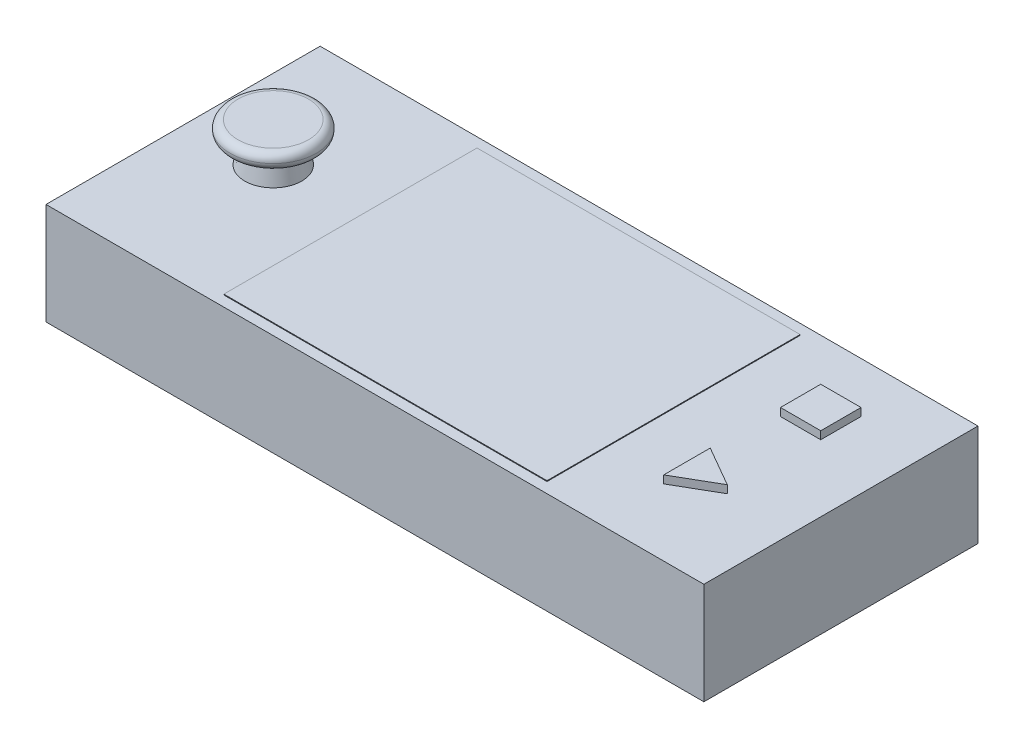
ISO-10303-21;
HEADER;
FILE_DESCRIPTION(('STEP AP214'),'2;1');
FILE_NAME('part.step','',(''),(''),'','','');
FILE_SCHEMA(('AUTOMOTIVE_DESIGN { 1 0 10303 214 1 1 1 1 }'));
ENDSEC;
DATA;
#1=APPLICATION_CONTEXT('core data for automotive mechanical design processes');
#2=APPLICATION_PROTOCOL_DEFINITION('international standard','automotive_design',2000,#1);
#3=PRODUCT_CONTEXT('',#1,'mechanical');
#4=PRODUCT('Part','Part','',(#3));
#5=PRODUCT_RELATED_PRODUCT_CATEGORY('part','',(#4));
#6=PRODUCT_DEFINITION_FORMATION('','',#4);
#7=PRODUCT_DEFINITION_CONTEXT('part definition',#1,'design');
#8=PRODUCT_DEFINITION('design','',#6,#7);
#9=PRODUCT_DEFINITION_SHAPE('','',#8);
#10=(LENGTH_UNIT() NAMED_UNIT(*) SI_UNIT(.MILLI.,.METRE.));
#11=(NAMED_UNIT(*) PLANE_ANGLE_UNIT() SI_UNIT($,.RADIAN.));
#12=(NAMED_UNIT(*) SI_UNIT($,.STERADIAN.) SOLID_ANGLE_UNIT());
#13=UNCERTAINTY_MEASURE_WITH_UNIT(LENGTH_MEASURE(1.E-05),#10,'distance_accuracy_value','');
#14=(GEOMETRIC_REPRESENTATION_CONTEXT(3) GLOBAL_UNCERTAINTY_ASSIGNED_CONTEXT((#13)) GLOBAL_UNIT_ASSIGNED_CONTEXT((#10,
#11,#12)) REPRESENTATION_CONTEXT('',''));
#15=CARTESIAN_POINT('',(0.,0.,0.));
#16=DIRECTION('',(0.,0.,1.));
#17=DIRECTION('',(1.,0.,0.));
#18=AXIS2_PLACEMENT_3D('',#15,#16,#17);
#19=CARTESIAN_POINT('',(0.,13.,0.));
#20=DIRECTION('',(0.,-1.,0.));
#21=DIRECTION('',(0.,0.,-1.));
#22=AXIS2_PLACEMENT_3D('',#19,#20,#21);
#23=PLANE('',#22);
#24=DIRECTION('',(0.,0.,1.));
#25=VECTOR('',#24,1.);
#26=CARTESIAN_POINT('',(28.3414793189935,13.,0.));
#27=LINE('',#26,#25);
#28=CARTESIAN_POINT('',(28.3414793189935,13.,3.03018633537985));
#29=VERTEX_POINT('',#28);
#30=CARTESIAN_POINT('',(28.3414793189935,13.,8.96750253399958));
#31=VERTEX_POINT('',#30);
#32=EDGE_CURVE('E295',#29,#31,#27,.T.);
#33=ORIENTED_EDGE('',*,*,#32,.F.);
#34=DIRECTION('',(-0.866025403784439,0.,-0.5));
#35=VECTOR('',#34,1.);
#36=CARTESIAN_POINT('',(5.77326065742866,13.,-9.99958078400494));
#37=LINE('',#36,#35);
#38=CARTESIAN_POINT('',(33.4833459772991,13.,5.99884443468971));
#39=VERTEX_POINT('',#38);
#40=EDGE_CURVE('E301',#39,#29,#37,.T.);
#41=ORIENTED_EDGE('',*,*,#40,.F.);
#42=DIRECTION('',(0.866025403784439,0.,-0.5));
#43=VECTOR('',#42,1.);
#44=CARTESIAN_POINT('',(10.9684123312209,13.,18.9978474360395));
#45=LINE('',#44,#43);
#46=EDGE_CURVE('E311',#31,#39,#45,.T.);
#47=ORIENTED_EDGE('',*,*,#46,.F.);
#48=EDGE_LOOP('',(#33,#41,#47));
#49=FACE_BOUND('',#48,.T.);
#50=DIRECTION('',(1.,0.,0.));
#51=VECTOR('',#50,1.);
#52=CARTESIAN_POINT('',(0.,13.,-11.0794983946822));
#53=LINE('',#52,#51);
#54=CARTESIAN_POINT('',(28.3414793189935,13.,-11.0794983946822));
#55=VERTEX_POINT('',#54);
#56=CARTESIAN_POINT('',(33.4833459772991,13.,-11.0794983946822));
#57=VERTEX_POINT('',#56);
#58=EDGE_CURVE('E348',#55,#57,#53,.T.);
#59=ORIENTED_EDGE('',*,*,#58,.T.);
#60=DIRECTION('',(0.,0.,1.));
#61=VECTOR('',#60,1.);
#62=CARTESIAN_POINT('',(33.4833459772991,13.,0.));
#63=LINE('',#62,#61);
#64=CARTESIAN_POINT('',(33.4833459772991,13.,-5.93763173637665));
#65=VERTEX_POINT('',#64);
#66=EDGE_CURVE('E329',#57,#65,#63,.T.);
#67=ORIENTED_EDGE('',*,*,#66,.T.);
#68=DIRECTION('',(1.,0.,0.));
#69=VECTOR('',#68,1.);
#70=CARTESIAN_POINT('',(0.,13.,-5.93763173637665));
#71=LINE('',#70,#69);
#72=CARTESIAN_POINT('',(28.3414793189935,13.,-5.93763173637665));
#73=VERTEX_POINT('',#72);
#74=EDGE_CURVE('E335',#73,#65,#71,.T.);
#75=ORIENTED_EDGE('',*,*,#74,.F.);
#76=DIRECTION('',(0.,0.,1.));
#77=VECTOR('',#76,1.);
#78=CARTESIAN_POINT('',(28.3414793189935,13.,0.));
#79=LINE('',#78,#77);
#80=EDGE_CURVE('E351',#55,#73,#79,.T.);
#81=ORIENTED_EDGE('',*,*,#80,.F.);
#82=EDGE_LOOP('',(#59,#67,#75,#81));
#83=FACE_BOUND('',#82,.T.);
#84=CARTESIAN_POINT('',(-31.8918158211568,13.,-1.40789206120276));
#85=DIRECTION('',(0.,-1.,0.));
#86=DIRECTION('',(0.,0.,-1.));
#87=AXIS2_PLACEMENT_3D('',#84,#85,#86);
#88=CIRCLE('',#87,3.63687920541314);
#89=CARTESIAN_POINT('',(-31.8918158211568,13.,-5.0447712666159));
#90=VERTEX_POINT('',#89);
#91=EDGE_CURVE('E419',#90,#90,#88,.F.);
#92=ORIENTED_EDGE('',*,*,#91,.F.);
#93=EDGE_LOOP('',(#92));
#94=FACE_BOUND('',#93,.T.);
#95=DIRECTION('',(0.,0.,-1.));
#96=VECTOR('',#95,1.);
#97=CARTESIAN_POINT('',(42.,13.,17.5));
#98=LINE('',#97,#96);
#99=CARTESIAN_POINT('',(42.,13.,17.5));
#100=VERTEX_POINT('',#99);
#101=CARTESIAN_POINT('',(42.,13.,-17.5));
#102=VERTEX_POINT('',#101);
#103=EDGE_CURVE('E378',#100,#102,#98,.T.);
#104=ORIENTED_EDGE('',*,*,#103,.T.);
#105=DIRECTION('',(-1.,0.,0.));
#106=VECTOR('',#105,1.);
#107=CARTESIAN_POINT('',(-42.,13.,-17.5));
#108=LINE('',#107,#106);
#109=CARTESIAN_POINT('',(-42.,13.,-17.5));
#110=VERTEX_POINT('',#109);
#111=EDGE_CURVE('E382',#102,#110,#108,.T.);
#112=ORIENTED_EDGE('',*,*,#111,.T.);
#113=DIRECTION('',(0.,0.,1.));
#114=VECTOR('',#113,1.);
#115=CARTESIAN_POINT('',(-42.,13.,17.5));
#116=LINE('',#115,#114);
#117=CARTESIAN_POINT('',(-42.,13.,17.5));
#118=VERTEX_POINT('',#117);
#119=EDGE_CURVE('E386',#110,#118,#116,.T.);
#120=ORIENTED_EDGE('',*,*,#119,.T.);
#121=DIRECTION('',(1.,0.,0.));
#122=VECTOR('',#121,1.);
#123=CARTESIAN_POINT('',(-42.,13.,17.5));
#124=LINE('',#123,#122);
#125=EDGE_CURVE('E389',#118,#100,#124,.T.);
#126=ORIENTED_EDGE('',*,*,#125,.T.);
#127=EDGE_LOOP('',(#104,#112,#120,#126));
#128=FACE_BOUND('',#127,.T.);
#129=DIRECTION('',(1.,0.,0.));
#130=VECTOR('',#129,1.);
#131=CARTESIAN_POINT('',(0.,13.,16.1601523546745));
#132=LINE('',#131,#130);
#133=CARTESIAN_POINT('',(-20.6286793315352,13.,16.1601523546745));
#134=VERTEX_POINT('',#133);
#135=CARTESIAN_POINT('',(20.6286793315352,13.,16.1601523546745));
#136=VERTEX_POINT('',#135);
#137=EDGE_CURVE('E271',#134,#136,#132,.T.);
#138=ORIENTED_EDGE('',*,*,#137,.F.);
#139=DIRECTION('',(0.,0.,-1.));
#140=VECTOR('',#139,1.);
#141=CARTESIAN_POINT('',(-20.6286793315352,13.,0.));
#142=LINE('',#141,#140);
#143=CARTESIAN_POINT('',(-20.6286793315352,13.,-16.1601523546745));
#144=VERTEX_POINT('',#143);
#145=EDGE_CURVE('E259',#134,#144,#142,.T.);
#146=ORIENTED_EDGE('',*,*,#145,.T.);
#147=DIRECTION('',(1.,0.,0.));
#148=VECTOR('',#147,1.);
#149=CARTESIAN_POINT('',(0.,13.,-16.1601523546745));
#150=LINE('',#149,#148);
#151=CARTESIAN_POINT('',(20.6286793315352,13.,-16.1601523546745));
#152=VERTEX_POINT('',#151);
#153=EDGE_CURVE('E68',#144,#152,#150,.T.);
#154=ORIENTED_EDGE('',*,*,#153,.T.);
#155=DIRECTION('',(0.,0.,-1.));
#156=VECTOR('',#155,1.);
#157=CARTESIAN_POINT('',(20.6286793315352,13.,0.));
#158=LINE('',#157,#156);
#159=EDGE_CURVE('E275',#136,#152,#158,.T.);
#160=ORIENTED_EDGE('',*,*,#159,.F.);
#161=EDGE_LOOP('',(#138,#146,#154,#160));
#162=FACE_BOUND('',#161,.T.);
#163=ADVANCED_FACE('F43',(#49,#83,#94,#128,#162),#23,.F.);
#164=CARTESIAN_POINT('',(42.,13.,17.5));
#165=DIRECTION('',(-1.,0.,0.));
#166=DIRECTION('',(0.,0.,1.));
#167=AXIS2_PLACEMENT_3D('',#164,#165,#166);
#168=PLANE('',#167);
#169=DIRECTION('',(0.,0.,-1.));
#170=VECTOR('',#169,1.);
#171=CARTESIAN_POINT('',(42.,0.,17.5));
#172=LINE('',#171,#170);
#173=CARTESIAN_POINT('',(42.,0.,17.5));
#174=VERTEX_POINT('',#173);
#175=CARTESIAN_POINT('',(42.,0.,-17.5));
#176=VERTEX_POINT('',#175);
#177=EDGE_CURVE('E377',#174,#176,#172,.T.);
#178=ORIENTED_EDGE('',*,*,#177,.T.);
#179=DIRECTION('',(0.,-1.,0.));
#180=VECTOR('',#179,1.);
#181=CARTESIAN_POINT('',(42.,13.,-17.5));
#182=LINE('',#181,#180);
#183=EDGE_CURVE('E415',#102,#176,#182,.T.);
#184=ORIENTED_EDGE('',*,*,#183,.F.);
#185=ORIENTED_EDGE('',*,*,#103,.F.);
#186=DIRECTION('',(0.,-1.,0.));
#187=VECTOR('',#186,1.);
#188=CARTESIAN_POINT('',(42.,13.,17.5));
#189=LINE('',#188,#187);
#190=EDGE_CURVE('E392',#100,#174,#189,.T.);
#191=ORIENTED_EDGE('',*,*,#190,.T.);
#192=EDGE_LOOP('',(#178,#184,#185,#191));
#193=FACE_BOUND('',#192,.T.);
#194=ADVANCED_FACE('F462',(#193),#168,.F.);
#195=CARTESIAN_POINT('',(-42.,13.,-17.5));
#196=DIRECTION('',(0.,0.,1.));
#197=DIRECTION('',(1.,0.,0.));
#198=AXIS2_PLACEMENT_3D('',#195,#196,#197);
#199=PLANE('',#198);
#200=DIRECTION('',(-1.,0.,0.));
#201=VECTOR('',#200,1.);
#202=CARTESIAN_POINT('',(-42.,0.,-17.5));
#203=LINE('',#202,#201);
#204=CARTESIAN_POINT('',(-42.,0.,-17.5));
#205=VERTEX_POINT('',#204);
#206=EDGE_CURVE('E396',#176,#205,#203,.T.);
#207=ORIENTED_EDGE('',*,*,#206,.T.);
#208=DIRECTION('',(0.,-1.,0.));
#209=VECTOR('',#208,1.);
#210=CARTESIAN_POINT('',(-42.,13.,-17.5));
#211=LINE('',#210,#209);
#212=EDGE_CURVE('E411',#110,#205,#211,.T.);
#213=ORIENTED_EDGE('',*,*,#212,.F.);
#214=ORIENTED_EDGE('',*,*,#111,.F.);
#215=ORIENTED_EDGE('',*,*,#183,.T.);
#216=EDGE_LOOP('',(#207,#213,#214,#215));
#217=FACE_BOUND('',#216,.T.);
#218=ADVANCED_FACE('F473',(#217),#199,.F.);
#219=CARTESIAN_POINT('',(-42.,13.,17.5));
#220=DIRECTION('',(1.,0.,0.));
#221=DIRECTION('',(0.,0.,-1.));
#222=AXIS2_PLACEMENT_3D('',#219,#220,#221);
#223=PLANE('',#222);
#224=DIRECTION('',(0.,0.,1.));
#225=VECTOR('',#224,1.);
#226=CARTESIAN_POINT('',(-42.,0.,17.5));
#227=LINE('',#226,#225);
#228=CARTESIAN_POINT('',(-42.,0.,17.5));
#229=VERTEX_POINT('',#228);
#230=EDGE_CURVE('E399',#205,#229,#227,.T.);
#231=ORIENTED_EDGE('',*,*,#230,.T.);
#232=DIRECTION('',(0.,-1.,0.));
#233=VECTOR('',#232,1.);
#234=CARTESIAN_POINT('',(-42.,13.,17.5));
#235=LINE('',#234,#233);
#236=EDGE_CURVE('E407',#118,#229,#235,.T.);
#237=ORIENTED_EDGE('',*,*,#236,.F.);
#238=ORIENTED_EDGE('',*,*,#119,.F.);
#239=ORIENTED_EDGE('',*,*,#212,.T.);
#240=EDGE_LOOP('',(#231,#237,#238,#239));
#241=FACE_BOUND('',#240,.T.);
#242=ADVANCED_FACE('F470',(#241),#223,.F.);
#243=CARTESIAN_POINT('',(-42.,13.,17.5));
#244=DIRECTION('',(0.,0.,-1.));
#245=DIRECTION('',(-1.,0.,0.));
#246=AXIS2_PLACEMENT_3D('',#243,#244,#245);
#247=PLANE('',#246);
#248=DIRECTION('',(1.,0.,0.));
#249=VECTOR('',#248,1.);
#250=CARTESIAN_POINT('',(-42.,0.,17.5));
#251=LINE('',#250,#249);
#252=EDGE_CURVE('E383',#229,#174,#251,.T.);
#253=ORIENTED_EDGE('',*,*,#252,.T.);
#254=ORIENTED_EDGE('',*,*,#190,.F.);
#255=ORIENTED_EDGE('',*,*,#125,.F.);
#256=ORIENTED_EDGE('',*,*,#236,.T.);
#257=EDGE_LOOP('',(#253,#254,#255,#256));
#258=FACE_BOUND('',#257,.T.);
#259=ADVANCED_FACE('F450',(#258),#247,.F.);
#260=CARTESIAN_POINT('',(0.,0.,0.));
#261=DIRECTION('',(0.,-1.,0.));
#262=DIRECTION('',(0.,0.,-1.));
#263=AXIS2_PLACEMENT_3D('',#260,#261,#262);
#264=PLANE('',#263);
#265=CARTESIAN_POINT('',(-38.,0.,-8.));
#266=DIRECTION('',(0.,-1.,0.));
#267=DIRECTION('',(0.,0.,-1.));
#268=AXIS2_PLACEMENT_3D('',#265,#266,#267);
#269=CIRCLE('',#268,2.);
#270=CARTESIAN_POINT('',(-38.,0.,-10.));
#271=VERTEX_POINT('',#270);
#272=EDGE_CURVE('E234',#271,#271,#269,.T.);
#273=ORIENTED_EDGE('',*,*,#272,.F.);
#274=EDGE_LOOP('',(#273));
#275=FACE_BOUND('',#274,.T.);
#276=CARTESIAN_POINT('',(9.99999999999999,0.,8.));
#277=DIRECTION('',(0.,-1.,0.));
#278=DIRECTION('',(0.,0.,-1.));
#279=AXIS2_PLACEMENT_3D('',#276,#277,#278);
#280=CIRCLE('',#279,2.);
#281=CARTESIAN_POINT('',(9.99999999999999,0.,6.));
#282=VERTEX_POINT('',#281);
#283=EDGE_CURVE('E242',#282,#282,#280,.T.);
#284=ORIENTED_EDGE('',*,*,#283,.F.);
#285=EDGE_LOOP('',(#284));
#286=FACE_BOUND('',#285,.T.);
#287=CARTESIAN_POINT('',(9.99999999999999,0.,-8.));
#288=DIRECTION('',(0.,-1.,0.));
#289=DIRECTION('',(0.,0.,-1.));
#290=AXIS2_PLACEMENT_3D('',#287,#288,#289);
#291=CIRCLE('',#290,2.);
#292=CARTESIAN_POINT('',(9.99999999999999,0.,-10.));
#293=VERTEX_POINT('',#292);
#294=EDGE_CURVE('E206',#293,#293,#291,.T.);
#295=ORIENTED_EDGE('',*,*,#294,.F.);
#296=EDGE_LOOP('',(#295));
#297=FACE_BOUND('',#296,.T.);
#298=DIRECTION('',(0.,0.,1.));
#299=VECTOR('',#298,1.);
#300=CARTESIAN_POINT('',(25.5,0.,10.));
#301=LINE('',#300,#299);
#302=CARTESIAN_POINT('',(25.5,0.,-10.));
#303=VERTEX_POINT('',#302);
#304=CARTESIAN_POINT('',(25.5,0.,10.));
#305=VERTEX_POINT('',#304);
#306=EDGE_CURVE('E60',#303,#305,#301,.T.);
#307=ORIENTED_EDGE('',*,*,#306,.F.);
#308=DIRECTION('',(1.,0.,0.));
#309=VECTOR('',#308,1.);
#310=CARTESIAN_POINT('',(16.5,0.,-10.));
#311=LINE('',#310,#309);
#312=CARTESIAN_POINT('',(16.5,0.,-10.));
#313=VERTEX_POINT('',#312);
#314=EDGE_CURVE('E199',#313,#303,#311,.T.);
#315=ORIENTED_EDGE('',*,*,#314,.F.);
#316=DIRECTION('',(0.,0.,-1.));
#317=VECTOR('',#316,1.);
#318=CARTESIAN_POINT('',(16.5,0.,10.));
#319=LINE('',#318,#317);
#320=CARTESIAN_POINT('',(16.5,0.,10.));
#321=VERTEX_POINT('',#320);
#322=EDGE_CURVE('E203',#321,#313,#319,.T.);
#323=ORIENTED_EDGE('',*,*,#322,.F.);
#324=DIRECTION('',(-1.,0.,0.));
#325=VECTOR('',#324,1.);
#326=CARTESIAN_POINT('',(16.5,0.,10.));
#327=LINE('',#326,#325);
#328=EDGE_CURVE('E215',#305,#321,#327,.T.);
#329=ORIENTED_EDGE('',*,*,#328,.F.);
#330=EDGE_LOOP('',(#307,#315,#323,#329));
#331=FACE_BOUND('',#330,.T.);
#332=CARTESIAN_POINT('',(-38.,0.,8.));
#333=DIRECTION('',(0.,-1.,0.));
#334=DIRECTION('',(0.,0.,-1.));
#335=AXIS2_PLACEMENT_3D('',#332,#333,#334);
#336=CIRCLE('',#335,2.);
#337=CARTESIAN_POINT('',(-38.,0.,6.));
#338=VERTEX_POINT('',#337);
#339=EDGE_CURVE('E233',#338,#338,#336,.T.);
#340=ORIENTED_EDGE('',*,*,#339,.F.);
#341=EDGE_LOOP('',(#340));
#342=FACE_BOUND('',#341,.T.);
#343=ORIENTED_EDGE('',*,*,#177,.F.);
#344=ORIENTED_EDGE('',*,*,#252,.F.);
#345=ORIENTED_EDGE('',*,*,#230,.F.);
#346=ORIENTED_EDGE('',*,*,#206,.F.);
#347=EDGE_LOOP('',(#343,#344,#345,#346));
#348=FACE_BOUND('',#347,.T.);
#349=ADVANCED_FACE('F446',(#275,#286,#297,#331,#342,#348),#264,.T.);
#350=CARTESIAN_POINT('',(-31.8918158211568,13.,-1.40789206120276));
#351=DIRECTION('',(0.,-1.,0.));
#352=DIRECTION('',(0.,0.,1.));
#353=AXIS2_PLACEMENT_3D('',#350,#351,#352);
#354=CONICAL_SURFACE('',#353,3.63687920541314,0.174532925199433);
#355=CARTESIAN_POINT('',(-31.8918158211568,16.,-1.40789206120276));
#356=DIRECTION('',(0.,1.,0.));
#357=DIRECTION('',(0.,0.,1.));
#358=AXIS2_PLACEMENT_3D('',#355,#356,#357);
#359=CIRCLE('',#358,3.10789826328775);
#360=CARTESIAN_POINT('',(-31.8918158211568,16.,1.70000620208499));
#361=VERTEX_POINT('',#360);
#362=EDGE_CURVE('E373',#361,#361,#359,.T.);
#363=ORIENTED_EDGE('',*,*,#362,.F.);
#364=EDGE_LOOP('',(#363));
#365=FACE_BOUND('',#364,.T.);
#366=ORIENTED_EDGE('',*,*,#91,.T.);
#367=EDGE_LOOP('',(#366));
#368=FACE_BOUND('',#367,.T.);
#369=ADVANCED_FACE('F449',(#365,#368),#354,.T.);
#370=CARTESIAN_POINT('',(33.4833459772991,14.,0.));
#371=DIRECTION('',(1.,0.,0.));
#372=DIRECTION('',(0.,0.,-1.));
#373=AXIS2_PLACEMENT_3D('',#370,#371,#372);
#374=PLANE('',#373);
#375=ORIENTED_EDGE('',*,*,#66,.F.);
#376=DIRECTION('',(0.,-1.,0.));
#377=VECTOR('',#376,1.);
#378=CARTESIAN_POINT('',(33.4833459772991,14.,-11.0794983946822));
#379=LINE('',#378,#377);
#380=CARTESIAN_POINT('',(33.4833459772991,14.,-11.0794983946822));
#381=VERTEX_POINT('',#380);
#382=EDGE_CURVE('E369',#381,#57,#379,.T.);
#383=ORIENTED_EDGE('',*,*,#382,.F.);
#384=DIRECTION('',(0.,0.,1.));
#385=VECTOR('',#384,1.);
#386=CARTESIAN_POINT('',(33.4833459772991,14.,0.));
#387=LINE('',#386,#385);
#388=CARTESIAN_POINT('',(33.4833459772991,14.,-5.93763173637665));
#389=VERTEX_POINT('',#388);
#390=EDGE_CURVE('E330',#381,#389,#387,.T.);
#391=ORIENTED_EDGE('',*,*,#390,.T.);
#392=DIRECTION('',(0.,-1.,0.));
#393=VECTOR('',#392,1.);
#394=CARTESIAN_POINT('',(33.4833459772991,14.,-5.93763173637665));
#395=LINE('',#394,#393);
#396=EDGE_CURVE('E345',#389,#65,#395,.T.);
#397=ORIENTED_EDGE('',*,*,#396,.T.);
#398=EDGE_LOOP('',(#375,#383,#391,#397));
#399=FACE_BOUND('',#398,.T.);
#400=ADVANCED_FACE('F537',(#399),#374,.T.);
#401=CARTESIAN_POINT('',(0.,14.,-11.0794983946822));
#402=DIRECTION('',(0.,0.,-1.));
#403=DIRECTION('',(-1.,0.,0.));
#404=AXIS2_PLACEMENT_3D('',#401,#402,#403);
#405=PLANE('',#404);
#406=ORIENTED_EDGE('',*,*,#58,.F.);
#407=DIRECTION('',(0.,-1.,0.));
#408=VECTOR('',#407,1.);
#409=CARTESIAN_POINT('',(28.3414793189935,14.,-11.0794983946822));
#410=LINE('',#409,#408);
#411=CARTESIAN_POINT('',(28.3414793189935,14.,-11.0794983946822));
#412=VERTEX_POINT('',#411);
#413=EDGE_CURVE('E365',#412,#55,#410,.T.);
#414=ORIENTED_EDGE('',*,*,#413,.F.);
#415=DIRECTION('',(1.,0.,0.));
#416=VECTOR('',#415,1.);
#417=CARTESIAN_POINT('',(0.,14.,-11.0794983946822));
#418=LINE('',#417,#416);
#419=EDGE_CURVE('E334',#412,#381,#418,.T.);
#420=ORIENTED_EDGE('',*,*,#419,.T.);
#421=ORIENTED_EDGE('',*,*,#382,.T.);
#422=EDGE_LOOP('',(#406,#414,#420,#421));
#423=FACE_BOUND('',#422,.T.);
#424=ADVANCED_FACE('F533',(#423),#405,.T.);
#425=CARTESIAN_POINT('',(28.3414793189935,14.,0.));
#426=DIRECTION('',(1.,0.,0.));
#427=DIRECTION('',(0.,0.,-1.));
#428=AXIS2_PLACEMENT_3D('',#425,#426,#427);
#429=PLANE('',#428);
#430=ORIENTED_EDGE('',*,*,#80,.T.);
#431=DIRECTION('',(0.,-1.,0.));
#432=VECTOR('',#431,1.);
#433=CARTESIAN_POINT('',(28.3414793189935,14.,-5.93763173637665));
#434=LINE('',#433,#432);
#435=CARTESIAN_POINT('',(28.3414793189935,14.,-5.93763173637665));
#436=VERTEX_POINT('',#435);
#437=EDGE_CURVE('E361',#436,#73,#434,.T.);
#438=ORIENTED_EDGE('',*,*,#437,.F.);
#439=DIRECTION('',(0.,0.,1.));
#440=VECTOR('',#439,1.);
#441=CARTESIAN_POINT('',(28.3414793189935,14.,0.));
#442=LINE('',#441,#440);
#443=EDGE_CURVE('E339',#412,#436,#442,.T.);
#444=ORIENTED_EDGE('',*,*,#443,.F.);
#445=ORIENTED_EDGE('',*,*,#413,.T.);
#446=EDGE_LOOP('',(#430,#438,#444,#445));
#447=FACE_BOUND('',#446,.T.);
#448=ADVANCED_FACE('F529',(#447),#429,.F.);
#449=CARTESIAN_POINT('',(0.,14.,-5.93763173637665));
#450=DIRECTION('',(0.,0.,-1.));
#451=DIRECTION('',(-1.,0.,0.));
#452=AXIS2_PLACEMENT_3D('',#449,#450,#451);
#453=PLANE('',#452);
#454=ORIENTED_EDGE('',*,*,#74,.T.);
#455=ORIENTED_EDGE('',*,*,#396,.F.);
#456=DIRECTION('',(1.,0.,0.));
#457=VECTOR('',#456,1.);
#458=CARTESIAN_POINT('',(0.,14.,-5.93763173637665));
#459=LINE('',#458,#457);
#460=EDGE_CURVE('E342',#436,#389,#459,.T.);
#461=ORIENTED_EDGE('',*,*,#460,.F.);
#462=ORIENTED_EDGE('',*,*,#437,.T.);
#463=EDGE_LOOP('',(#454,#455,#461,#462));
#464=FACE_BOUND('',#463,.T.);
#465=ADVANCED_FACE('F525',(#464),#453,.F.);
#466=CARTESIAN_POINT('',(0.,14.,0.));
#467=DIRECTION('',(0.,1.,0.));
#468=DIRECTION('',(0.,0.,1.));
#469=AXIS2_PLACEMENT_3D('',#466,#467,#468);
#470=PLANE('',#469);
#471=ORIENTED_EDGE('',*,*,#390,.F.);
#472=ORIENTED_EDGE('',*,*,#419,.F.);
#473=ORIENTED_EDGE('',*,*,#443,.T.);
#474=ORIENTED_EDGE('',*,*,#460,.T.);
#475=EDGE_LOOP('',(#471,#472,#473,#474));
#476=FACE_BOUND('',#475,.T.);
#477=ADVANCED_FACE('F521',(#476),#470,.T.);
#478=CARTESIAN_POINT('',(28.3414793189935,14.,0.));
#479=DIRECTION('',(1.,0.,0.));
#480=DIRECTION('',(0.,0.,-1.));
#481=AXIS2_PLACEMENT_3D('',#478,#479,#480);
#482=PLANE('',#481);
#483=ORIENTED_EDGE('',*,*,#32,.T.);
#484=DIRECTION('',(0.,-1.,0.));
#485=VECTOR('',#484,1.);
#486=CARTESIAN_POINT('',(28.3414793189935,14.,8.96750253399958));
#487=LINE('',#486,#485);
#488=CARTESIAN_POINT('',(28.3414793189935,14.,8.96750253399958));
#489=VERTEX_POINT('',#488);
#490=EDGE_CURVE('E325',#489,#31,#487,.T.);
#491=ORIENTED_EDGE('',*,*,#490,.F.);
#492=DIRECTION('',(0.,0.,1.));
#493=VECTOR('',#492,1.);
#494=CARTESIAN_POINT('',(28.3414793189935,14.,0.));
#495=LINE('',#494,#493);
#496=CARTESIAN_POINT('',(28.3414793189935,14.,3.03018633537985));
#497=VERTEX_POINT('',#496);
#498=EDGE_CURVE('E296',#497,#489,#495,.T.);
#499=ORIENTED_EDGE('',*,*,#498,.F.);
#500=DIRECTION('',(0.,-1.,0.));
#501=VECTOR('',#500,1.);
#502=CARTESIAN_POINT('',(28.3414793189935,14.,3.03018633537985));
#503=LINE('',#502,#501);
#504=EDGE_CURVE('E307',#497,#29,#503,.T.);
#505=ORIENTED_EDGE('',*,*,#504,.T.);
#506=EDGE_LOOP('',(#483,#491,#499,#505));
#507=FACE_BOUND('',#506,.T.);
#508=ADVANCED_FACE('F517',(#507),#482,.F.);
#509=CARTESIAN_POINT('',(10.9684123312209,14.,18.9978474360395));
#510=DIRECTION('',(-0.5,0.,-0.866025403784439));
#511=DIRECTION('',(-0.866025403784439,0.,0.5));
#512=AXIS2_PLACEMENT_3D('',#509,#510,#511);
#513=PLANE('',#512);
#514=ORIENTED_EDGE('',*,*,#46,.T.);
#515=DIRECTION('',(0.,-1.,0.));
#516=VECTOR('',#515,1.);
#517=CARTESIAN_POINT('',(33.4833459772991,14.,5.99884443468971));
#518=LINE('',#517,#516);
#519=CARTESIAN_POINT('',(33.4833459772991,14.,5.99884443468971));
#520=VERTEX_POINT('',#519);
#521=EDGE_CURVE('E321',#520,#39,#518,.T.);
#522=ORIENTED_EDGE('',*,*,#521,.F.);
#523=DIRECTION('',(0.866025403784439,0.,-0.5));
#524=VECTOR('',#523,1.);
#525=CARTESIAN_POINT('',(10.9684123312209,14.,18.9978474360395));
#526=LINE('',#525,#524);
#527=EDGE_CURVE('E300',#489,#520,#526,.T.);
#528=ORIENTED_EDGE('',*,*,#527,.F.);
#529=ORIENTED_EDGE('',*,*,#490,.T.);
#530=EDGE_LOOP('',(#514,#522,#528,#529));
#531=FACE_BOUND('',#530,.T.);
#532=ADVANCED_FACE('F513',(#531),#513,.F.);
#533=CARTESIAN_POINT('',(5.77326065742866,14.,-9.99958078400494));
#534=DIRECTION('',(-0.5,0.,0.866025403784439));
#535=DIRECTION('',(0.866025403784439,0.,0.5));
#536=AXIS2_PLACEMENT_3D('',#533,#534,#535);
#537=PLANE('',#536);
#538=ORIENTED_EDGE('',*,*,#40,.T.);
#539=ORIENTED_EDGE('',*,*,#504,.F.);
#540=DIRECTION('',(-0.866025403784439,0.,-0.5));
#541=VECTOR('',#540,1.);
#542=CARTESIAN_POINT('',(5.77326065742866,14.,-9.99958078400494));
#543=LINE('',#542,#541);
#544=EDGE_CURVE('E304',#520,#497,#543,.T.);
#545=ORIENTED_EDGE('',*,*,#544,.F.);
#546=ORIENTED_EDGE('',*,*,#521,.T.);
#547=EDGE_LOOP('',(#538,#539,#545,#546));
#548=FACE_BOUND('',#547,.T.);
#549=ADVANCED_FACE('F509',(#548),#537,.F.);
#550=CARTESIAN_POINT('',(0.,14.,0.));
#551=DIRECTION('',(0.,1.,0.));
#552=DIRECTION('',(0.,0.,1.));
#553=AXIS2_PLACEMENT_3D('',#550,#551,#552);
#554=PLANE('',#553);
#555=ORIENTED_EDGE('',*,*,#498,.T.);
#556=ORIENTED_EDGE('',*,*,#527,.T.);
#557=ORIENTED_EDGE('',*,*,#544,.T.);
#558=EDGE_LOOP('',(#555,#556,#557));
#559=FACE_BOUND('',#558,.T.);
#560=ADVANCED_FACE('F503',(#559),#554,.T.);
#561=CARTESIAN_POINT('',(0.,13.1,16.1601523546745));
#562=DIRECTION('',(0.,0.,-1.));
#563=DIRECTION('',(-1.,0.,0.));
#564=AXIS2_PLACEMENT_3D('',#561,#562,#563);
#565=PLANE('',#564);
#566=ORIENTED_EDGE('',*,*,#137,.T.);
#567=DIRECTION('',(0.,-1.,0.));
#568=VECTOR('',#567,1.);
#569=CARTESIAN_POINT('',(20.6286793315352,13.1,16.1601523546745));
#570=LINE('',#569,#568);
#571=CARTESIAN_POINT('',(20.6286793315352,13.1,16.1601523546745));
#572=VERTEX_POINT('',#571);
#573=EDGE_CURVE('E292',#572,#136,#570,.T.);
#574=ORIENTED_EDGE('',*,*,#573,.F.);
#575=DIRECTION('',(1.,0.,0.));
#576=VECTOR('',#575,1.);
#577=CARTESIAN_POINT('',(0.,13.1,16.1601523546745));
#578=LINE('',#577,#576);
#579=CARTESIAN_POINT('',(-20.6286793315352,13.1,16.1601523546745));
#580=VERTEX_POINT('',#579);
#581=EDGE_CURVE('E254',#580,#572,#578,.T.);
#582=ORIENTED_EDGE('',*,*,#581,.F.);
#583=DIRECTION('',(0.,-1.,0.));
#584=VECTOR('',#583,1.);
#585=CARTESIAN_POINT('',(-20.6286793315352,13.1,16.1601523546745));
#586=LINE('',#585,#584);
#587=EDGE_CURVE('E270',#580,#134,#586,.T.);
#588=ORIENTED_EDGE('',*,*,#587,.T.);
#589=EDGE_LOOP('',(#566,#574,#582,#588));
#590=FACE_BOUND('',#589,.T.);
#591=ADVANCED_FACE('F484',(#590),#565,.F.);
#592=CARTESIAN_POINT('',(20.6286793315352,13.1,0.));
#593=DIRECTION('',(-1.,0.,0.));
#594=DIRECTION('',(0.,0.,1.));
#595=AXIS2_PLACEMENT_3D('',#592,#593,#594);
#596=PLANE('',#595);
#597=ORIENTED_EDGE('',*,*,#159,.T.);
#598=DIRECTION('',(0.,-1.,0.));
#599=VECTOR('',#598,1.);
#600=CARTESIAN_POINT('',(20.6286793315352,13.1,-16.1601523546745));
#601=LINE('',#600,#599);
#602=CARTESIAN_POINT('',(20.6286793315352,13.1,-16.1601523546745));
#603=VERTEX_POINT('',#602);
#604=EDGE_CURVE('E289',#603,#152,#601,.T.);
#605=ORIENTED_EDGE('',*,*,#604,.F.);
#606=DIRECTION('',(0.,0.,-1.));
#607=VECTOR('',#606,1.);
#608=CARTESIAN_POINT('',(20.6286793315352,13.1,0.));
#609=LINE('',#608,#607);
#610=EDGE_CURVE('E258',#572,#603,#609,.T.);
#611=ORIENTED_EDGE('',*,*,#610,.F.);
#612=ORIENTED_EDGE('',*,*,#573,.T.);
#613=EDGE_LOOP('',(#597,#605,#611,#612));
#614=FACE_BOUND('',#613,.T.);
#615=ADVANCED_FACE('F495',(#614),#596,.F.);
#616=CARTESIAN_POINT('',(0.,13.1,-16.1601523546745));
#617=DIRECTION('',(0.,0.,-1.));
#618=DIRECTION('',(-1.,0.,0.));
#619=AXIS2_PLACEMENT_3D('',#616,#617,#618);
#620=PLANE('',#619);
#621=ORIENTED_EDGE('',*,*,#153,.F.);
#622=DIRECTION('',(0.,-1.,0.));
#623=VECTOR('',#622,1.);
#624=CARTESIAN_POINT('',(-20.6286793315352,13.1,-16.1601523546745));
#625=LINE('',#624,#623);
#626=CARTESIAN_POINT('',(-20.6286793315352,13.1,-16.1601523546745));
#627=VERTEX_POINT('',#626);
#628=EDGE_CURVE('E286',#627,#144,#625,.T.);
#629=ORIENTED_EDGE('',*,*,#628,.F.);
#630=DIRECTION('',(1.,0.,0.));
#631=VECTOR('',#630,1.);
#632=CARTESIAN_POINT('',(0.,13.1,-16.1601523546745));
#633=LINE('',#632,#631);
#634=EDGE_CURVE('E262',#627,#603,#633,.T.);
#635=ORIENTED_EDGE('',*,*,#634,.T.);
#636=ORIENTED_EDGE('',*,*,#604,.T.);
#637=EDGE_LOOP('',(#621,#629,#635,#636));
#638=FACE_BOUND('',#637,.T.);
#639=ADVANCED_FACE('F490',(#638),#620,.T.);
#640=CARTESIAN_POINT('',(-20.6286793315352,13.1,0.));
#641=DIRECTION('',(-1.,0.,0.));
#642=DIRECTION('',(0.,0.,1.));
#643=AXIS2_PLACEMENT_3D('',#640,#641,#642);
#644=PLANE('',#643);
#645=ORIENTED_EDGE('',*,*,#145,.F.);
#646=ORIENTED_EDGE('',*,*,#587,.F.);
#647=DIRECTION('',(0.,0.,-1.));
#648=VECTOR('',#647,1.);
#649=CARTESIAN_POINT('',(-20.6286793315352,13.1,0.));
#650=LINE('',#649,#648);
#651=EDGE_CURVE('E266',#580,#627,#650,.T.);
#652=ORIENTED_EDGE('',*,*,#651,.T.);
#653=ORIENTED_EDGE('',*,*,#628,.T.);
#654=EDGE_LOOP('',(#645,#646,#652,#653));
#655=FACE_BOUND('',#654,.T.);
#656=ADVANCED_FACE('F488',(#655),#644,.T.);
#657=CARTESIAN_POINT('',(0.,13.1,0.));
#658=DIRECTION('',(0.,1.,0.));
#659=DIRECTION('',(0.,0.,1.));
#660=AXIS2_PLACEMENT_3D('',#657,#658,#659);
#661=PLANE('',#660);
#662=ORIENTED_EDGE('',*,*,#581,.T.);
#663=ORIENTED_EDGE('',*,*,#610,.T.);
#664=ORIENTED_EDGE('',*,*,#634,.F.);
#665=ORIENTED_EDGE('',*,*,#651,.F.);
#666=EDGE_LOOP('',(#662,#663,#664,#665));
#667=FACE_BOUND('',#666,.T.);
#668=ADVANCED_FACE('F492',(#667),#661,.T.);
#669=CARTESIAN_POINT('',(-31.8918158211568,18.,-1.40789206120276));
#670=DIRECTION('',(0.,1.,0.));
#671=DIRECTION('',(0.,0.,1.));
#672=AXIS2_PLACEMENT_3D('',#669,#670,#671);
#673=PLANE('',#672);
#674=CARTESIAN_POINT('',(-31.8918158211568,18.,-1.40789206120276));
#675=DIRECTION('',(0.,1.,0.));
#676=DIRECTION('',(0.,0.,1.));
#677=AXIS2_PLACEMENT_3D('',#674,#675,#676);
#678=CIRCLE('',#677,4.5);
#679=CARTESIAN_POINT('',(-31.8918158211568,18.,3.09210793879724));
#680=VERTEX_POINT('',#679);
#681=EDGE_CURVE('E11',#680,#680,#678,.T.);
#682=ORIENTED_EDGE('',*,*,#681,.T.);
#683=EDGE_LOOP('',(#682));
#684=FACE_BOUND('',#683,.T.);
#685=ADVANCED_FACE('F647',(#684),#673,.T.);
#686=CARTESIAN_POINT('',(-31.8918158211568,16.,-1.40789206120276));
#687=DIRECTION('',(0.,1.,0.));
#688=DIRECTION('',(0.,0.,1.));
#689=AXIS2_PLACEMENT_3D('',#686,#687,#688);
#690=PLANE('',#689);
#691=CARTESIAN_POINT('',(-31.8918158211568,16.,-1.40789206120276));
#692=DIRECTION('',(0.,1.,0.));
#693=DIRECTION('',(0.,0.,1.));
#694=AXIS2_PLACEMENT_3D('',#691,#692,#693);
#695=CIRCLE('',#694,4.5);
#696=CARTESIAN_POINT('',(-31.8918158211568,16.,3.09210793879724));
#697=VERTEX_POINT('',#696);
#698=EDGE_CURVE('E53',#697,#697,#695,.F.);
#699=ORIENTED_EDGE('',*,*,#698,.T.);
#700=EDGE_LOOP('',(#699));
#701=FACE_BOUND('',#700,.T.);
#702=ORIENTED_EDGE('',*,*,#362,.T.);
#703=EDGE_LOOP('',(#702));
#704=FACE_BOUND('',#703,.T.);
#705=ADVANCED_FACE('F427',(#701,#704),#690,.F.);
#706=CARTESIAN_POINT('',(-31.8918158211568,17.,-1.40789206120276));
#707=DIRECTION('',(0.,1.,0.));
#708=DIRECTION('',(0.,0.,1.));
#709=AXIS2_PLACEMENT_3D('',#706,#707,#708);
#710=TOROIDAL_SURFACE('',#709,4.5,1.);
#711=ORIENTED_EDGE('',*,*,#681,.F.);
#712=EDGE_LOOP('',(#711));
#713=FACE_BOUND('',#712,.T.);
#714=CARTESIAN_POINT('',(-31.8918158211568,17.,-1.40789206120276));
#715=DIRECTION('',(0.,1.,0.));
#716=DIRECTION('',(0.,0.,1.));
#717=AXIS2_PLACEMENT_3D('',#714,#715,#716);
#718=CIRCLE('',#717,5.5);
#719=CARTESIAN_POINT('',(-31.8918158211568,17.,4.09210793879724));
#720=VERTEX_POINT('',#719);
#721=EDGE_CURVE('E47',#720,#720,#718,.F.);
#722=ORIENTED_EDGE('',*,*,#721,.F.);
#723=EDGE_LOOP('',(#722));
#724=FACE_BOUND('',#723,.T.);
#725=ADVANCED_FACE('F45',(#713,#724),#710,.T.);
#726=CARTESIAN_POINT('',(-31.8918158211568,17.,-1.40789206120276));
#727=DIRECTION('',(0.,1.,0.));
#728=DIRECTION('',(0.,0.,1.));
#729=AXIS2_PLACEMENT_3D('',#726,#727,#728);
#730=TOROIDAL_SURFACE('',#729,4.5,1.);
#731=ORIENTED_EDGE('',*,*,#698,.F.);
#732=EDGE_LOOP('',(#731));
#733=FACE_BOUND('',#732,.T.);
#734=ORIENTED_EDGE('',*,*,#721,.T.);
#735=EDGE_LOOP('',(#734));
#736=FACE_BOUND('',#735,.T.);
#737=ADVANCED_FACE('F430',(#733,#736),#730,.T.);
#738=CARTESIAN_POINT('',(-38.,6.,8.));
#739=DIRECTION('',(0.,-1.,0.));
#740=DIRECTION('',(0.,0.,-1.));
#741=AXIS2_PLACEMENT_3D('',#738,#739,#740);
#742=CYLINDRICAL_SURFACE('',#741,2.);
#743=CARTESIAN_POINT('',(-38.,6.,8.));
#744=DIRECTION('',(0.,-1.,0.));
#745=DIRECTION('',(0.,0.,-1.));
#746=AXIS2_PLACEMENT_3D('',#743,#744,#745);
#747=CIRCLE('',#746,2.);
#748=CARTESIAN_POINT('',(-38.,6.,6.));
#749=VERTEX_POINT('',#748);
#750=EDGE_CURVE('E247',#749,#749,#747,.T.);
#751=ORIENTED_EDGE('',*,*,#750,.F.);
#752=EDGE_LOOP('',(#751));
#753=FACE_BOUND('',#752,.T.);
#754=ORIENTED_EDGE('',*,*,#339,.T.);
#755=EDGE_LOOP('',(#754));
#756=FACE_BOUND('',#755,.T.);
#757=ADVANCED_FACE('F433',(#753,#756),#742,.F.);
#758=CARTESIAN_POINT('',(-38.,6.,8.));
#759=DIRECTION('',(0.,-1.,0.));
#760=DIRECTION('',(0.,0.,-1.));
#761=AXIS2_PLACEMENT_3D('',#758,#759,#760);
#762=PLANE('',#761);
#763=ORIENTED_EDGE('',*,*,#750,.T.);
#764=EDGE_LOOP('',(#763));
#765=FACE_BOUND('',#764,.T.);
#766=ADVANCED_FACE('F686',(#765),#762,.T.);
#767=CARTESIAN_POINT('',(25.5,6.,10.));
#768=DIRECTION('',(1.,0.,0.));
#769=DIRECTION('',(0.,0.,-1.));
#770=AXIS2_PLACEMENT_3D('',#767,#768,#769);
#771=PLANE('',#770);
#772=ORIENTED_EDGE('',*,*,#306,.T.);
#773=DIRECTION('',(0.,-1.,0.));
#774=VECTOR('',#773,1.);
#775=CARTESIAN_POINT('',(25.5,6.,10.));
#776=LINE('',#775,#774);
#777=CARTESIAN_POINT('',(25.5,6.,10.));
#778=VERTEX_POINT('',#777);
#779=EDGE_CURVE('E174',#778,#305,#776,.T.);
#780=ORIENTED_EDGE('',*,*,#779,.F.);
#781=DIRECTION('',(0.,0.,1.));
#782=VECTOR('',#781,1.);
#783=CARTESIAN_POINT('',(25.5,6.,10.));
#784=LINE('',#783,#782);
#785=CARTESIAN_POINT('',(25.5,6.,-10.));
#786=VERTEX_POINT('',#785);
#787=EDGE_CURVE('E178',#786,#778,#784,.T.);
#788=ORIENTED_EDGE('',*,*,#787,.F.);
#789=DIRECTION('',(0.,-1.,0.));
#790=VECTOR('',#789,1.);
#791=CARTESIAN_POINT('',(25.5,6.,-10.));
#792=LINE('',#791,#790);
#793=EDGE_CURVE('E221',#786,#303,#792,.T.);
#794=ORIENTED_EDGE('',*,*,#793,.T.);
#795=EDGE_LOOP('',(#772,#780,#788,#794));
#796=FACE_BOUND('',#795,.T.);
#797=ADVANCED_FACE('F176',(#796),#771,.F.);
#798=CARTESIAN_POINT('',(16.5,6.,-10.));
#799=DIRECTION('',(0.,0.,-1.));
#800=DIRECTION('',(-1.,0.,0.));
#801=AXIS2_PLACEMENT_3D('',#798,#799,#800);
#802=PLANE('',#801);
#803=ORIENTED_EDGE('',*,*,#314,.T.);
#804=ORIENTED_EDGE('',*,*,#793,.F.);
#805=DIRECTION('',(1.,0.,0.));
#806=VECTOR('',#805,1.);
#807=CARTESIAN_POINT('',(16.5,6.,-10.));
#808=LINE('',#807,#806);
#809=CARTESIAN_POINT('',(16.5,6.,-10.));
#810=VERTEX_POINT('',#809);
#811=EDGE_CURVE('E185',#810,#786,#808,.T.);
#812=ORIENTED_EDGE('',*,*,#811,.F.);
#813=DIRECTION('',(0.,-1.,0.));
#814=VECTOR('',#813,1.);
#815=CARTESIAN_POINT('',(16.5,6.,-10.));
#816=LINE('',#815,#814);
#817=EDGE_CURVE('E224',#810,#313,#816,.T.);
#818=ORIENTED_EDGE('',*,*,#817,.T.);
#819=EDGE_LOOP('',(#803,#804,#812,#818));
#820=FACE_BOUND('',#819,.T.);
#821=ADVANCED_FACE('F700',(#820),#802,.F.);
#822=CARTESIAN_POINT('',(16.5,6.,10.));
#823=DIRECTION('',(-1.,0.,0.));
#824=DIRECTION('',(0.,0.,1.));
#825=AXIS2_PLACEMENT_3D('',#822,#823,#824);
#826=PLANE('',#825);
#827=ORIENTED_EDGE('',*,*,#322,.T.);
#828=ORIENTED_EDGE('',*,*,#817,.F.);
#829=DIRECTION('',(0.,0.,-1.));
#830=VECTOR('',#829,1.);
#831=CARTESIAN_POINT('',(16.5,6.,10.));
#832=LINE('',#831,#830);
#833=CARTESIAN_POINT('',(16.5,6.,10.));
#834=VERTEX_POINT('',#833);
#835=EDGE_CURVE('E194',#834,#810,#832,.T.);
#836=ORIENTED_EDGE('',*,*,#835,.F.);
#837=DIRECTION('',(0.,-1.,0.));
#838=VECTOR('',#837,1.);
#839=CARTESIAN_POINT('',(16.5,6.,10.));
#840=LINE('',#839,#838);
#841=EDGE_CURVE('E184',#834,#321,#840,.T.);
#842=ORIENTED_EDGE('',*,*,#841,.T.);
#843=EDGE_LOOP('',(#827,#828,#836,#842));
#844=FACE_BOUND('',#843,.T.);
#845=ADVANCED_FACE('F707',(#844),#826,.F.);
#846=CARTESIAN_POINT('',(16.5,6.,10.));
#847=DIRECTION('',(0.,0.,1.));
#848=DIRECTION('',(1.,0.,0.));
#849=AXIS2_PLACEMENT_3D('',#846,#847,#848);
#850=PLANE('',#849);
#851=ORIENTED_EDGE('',*,*,#328,.T.);
#852=ORIENTED_EDGE('',*,*,#841,.F.);
#853=DIRECTION('',(-1.,0.,0.));
#854=VECTOR('',#853,1.);
#855=CARTESIAN_POINT('',(16.5,6.,10.));
#856=LINE('',#855,#854);
#857=EDGE_CURVE('E188',#778,#834,#856,.T.);
#858=ORIENTED_EDGE('',*,*,#857,.F.);
#859=ORIENTED_EDGE('',*,*,#779,.T.);
#860=EDGE_LOOP('',(#851,#852,#858,#859));
#861=FACE_BOUND('',#860,.T.);
#862=ADVANCED_FACE('F189',(#861),#850,.F.);
#863=CARTESIAN_POINT('',(0.,6.,0.));
#864=DIRECTION('',(0.,-1.,0.));
#865=DIRECTION('',(0.,0.,-1.));
#866=AXIS2_PLACEMENT_3D('',#863,#864,#865);
#867=PLANE('',#866);
#868=ORIENTED_EDGE('',*,*,#787,.T.);
#869=ORIENTED_EDGE('',*,*,#857,.T.);
#870=ORIENTED_EDGE('',*,*,#835,.T.);
#871=ORIENTED_EDGE('',*,*,#811,.T.);
#872=EDGE_LOOP('',(#868,#869,#870,#871));
#873=FACE_BOUND('',#872,.T.);
#874=ADVANCED_FACE('F196',(#873),#867,.T.);
#875=CARTESIAN_POINT('',(9.99999999999999,6.,-8.));
#876=DIRECTION('',(0.,-1.,0.));
#877=DIRECTION('',(0.,0.,-1.));
#878=AXIS2_PLACEMENT_3D('',#875,#876,#877);
#879=CYLINDRICAL_SURFACE('',#878,2.);
#880=CARTESIAN_POINT('',(9.99999999999999,6.,-8.));
#881=DIRECTION('',(0.,-1.,0.));
#882=DIRECTION('',(0.,0.,-1.));
#883=AXIS2_PLACEMENT_3D('',#880,#881,#882);
#884=CIRCLE('',#883,2.);
#885=CARTESIAN_POINT('',(9.99999999999999,6.,-10.));
#886=VERTEX_POINT('',#885);
#887=EDGE_CURVE('E246',#886,#886,#884,.T.);
#888=ORIENTED_EDGE('',*,*,#887,.F.);
#889=EDGE_LOOP('',(#888));
#890=FACE_BOUND('',#889,.T.);
#891=ORIENTED_EDGE('',*,*,#294,.T.);
#892=EDGE_LOOP('',(#891));
#893=FACE_BOUND('',#892,.T.);
#894=ADVANCED_FACE('F444',(#890,#893),#879,.F.);
#895=CARTESIAN_POINT('',(9.99999999999999,6.,-8.));
#896=DIRECTION('',(0.,-1.,0.));
#897=DIRECTION('',(0.,0.,-1.));
#898=AXIS2_PLACEMENT_3D('',#895,#896,#897);
#899=PLANE('',#898);
#900=ORIENTED_EDGE('',*,*,#887,.T.);
#901=EDGE_LOOP('',(#900));
#902=FACE_BOUND('',#901,.T.);
#903=ADVANCED_FACE('F734',(#902),#899,.T.);
#904=CARTESIAN_POINT('',(9.99999999999999,6.,8.));
#905=DIRECTION('',(0.,-1.,0.));
#906=DIRECTION('',(0.,0.,-1.));
#907=AXIS2_PLACEMENT_3D('',#904,#905,#906);
#908=CYLINDRICAL_SURFACE('',#907,2.);
#909=CARTESIAN_POINT('',(9.99999999999999,6.,8.));
#910=DIRECTION('',(0.,-1.,0.));
#911=DIRECTION('',(0.,0.,-1.));
#912=AXIS2_PLACEMENT_3D('',#909,#910,#911);
#913=CIRCLE('',#912,2.);
#914=CARTESIAN_POINT('',(9.99999999999999,6.,6.));
#915=VERTEX_POINT('',#914);
#916=EDGE_CURVE('E238',#915,#915,#913,.T.);
#917=ORIENTED_EDGE('',*,*,#916,.F.);
#918=EDGE_LOOP('',(#917));
#919=FACE_BOUND('',#918,.T.);
#920=ORIENTED_EDGE('',*,*,#283,.T.);
#921=EDGE_LOOP('',(#920));
#922=FACE_BOUND('',#921,.T.);
#923=ADVANCED_FACE('F742',(#919,#922),#908,.F.);
#924=CARTESIAN_POINT('',(9.99999999999999,6.,8.));
#925=DIRECTION('',(0.,-1.,0.));
#926=DIRECTION('',(0.,0.,-1.));
#927=AXIS2_PLACEMENT_3D('',#924,#925,#926);
#928=PLANE('',#927);
#929=ORIENTED_EDGE('',*,*,#916,.T.);
#930=EDGE_LOOP('',(#929));
#931=FACE_BOUND('',#930,.T.);
#932=ADVANCED_FACE('F751',(#931),#928,.T.);
#933=CARTESIAN_POINT('',(-38.,6.,-8.));
#934=DIRECTION('',(0.,-1.,0.));
#935=DIRECTION('',(0.,0.,-1.));
#936=AXIS2_PLACEMENT_3D('',#933,#934,#935);
#937=CYLINDRICAL_SURFACE('',#936,2.);
#938=CARTESIAN_POINT('',(-38.,6.,-8.));
#939=DIRECTION('',(0.,-1.,0.));
#940=DIRECTION('',(0.,0.,-1.));
#941=AXIS2_PLACEMENT_3D('',#938,#939,#940);
#942=CIRCLE('',#941,2.);
#943=CARTESIAN_POINT('',(-38.,6.,-10.));
#944=VERTEX_POINT('',#943);
#945=EDGE_CURVE('E229',#944,#944,#942,.T.);
#946=ORIENTED_EDGE('',*,*,#945,.F.);
#947=EDGE_LOOP('',(#946));
#948=FACE_BOUND('',#947,.T.);
#949=ORIENTED_EDGE('',*,*,#272,.T.);
#950=EDGE_LOOP('',(#949));
#951=FACE_BOUND('',#950,.T.);
#952=ADVANCED_FACE('F758',(#948,#951),#937,.F.);
#953=CARTESIAN_POINT('',(-38.,6.,-8.));
#954=DIRECTION('',(0.,-1.,0.));
#955=DIRECTION('',(0.,0.,-1.));
#956=AXIS2_PLACEMENT_3D('',#953,#954,#955);
#957=PLANE('',#956);
#958=ORIENTED_EDGE('',*,*,#945,.T.);
#959=EDGE_LOOP('',(#958));
#960=FACE_BOUND('',#959,.T.);
#961=ADVANCED_FACE('F766',(#960),#957,.T.);
#962=CLOSED_SHELL('',(#163,#194,#218,#242,#259,#349,#369,#400,#424,#448,#465,#477,#508,#532,
#549,#560,#591,#615,#639,#656,#668,#685,#705,#725,#737,#757,#766,#797,#821,#845,#862,#874,#894,
#903,#923,#932,#952,#961));
#963=MANIFOLD_SOLID_BREP('B2',#962);
#964=ADVANCED_BREP_SHAPE_REPRESENTATION('',(#18,#963),#14);
#965=SHAPE_DEFINITION_REPRESENTATION(#9,#964);
ENDSEC;
END-ISO-10303-21;
